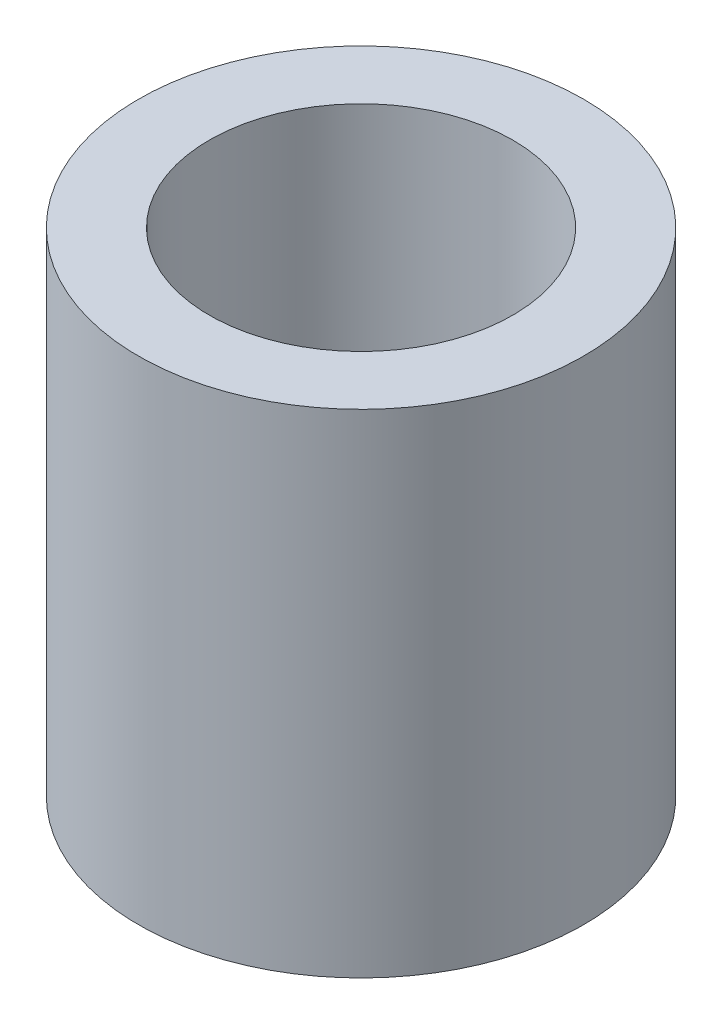
ISO-10303-21;
HEADER;
FILE_DESCRIPTION(('STEP AP214'),'2;1');
FILE_NAME('part.step','',(''),(''),'','','');
FILE_SCHEMA(('AUTOMOTIVE_DESIGN { 1 0 10303 214 1 1 1 1 }'));
ENDSEC;
DATA;
#1=APPLICATION_CONTEXT('core data for automotive mechanical design processes');
#2=APPLICATION_PROTOCOL_DEFINITION('international standard','automotive_design',2000,#1);
#3=PRODUCT_CONTEXT('',#1,'mechanical');
#4=PRODUCT('Part','Part','',(#3));
#5=PRODUCT_RELATED_PRODUCT_CATEGORY('part','',(#4));
#6=PRODUCT_DEFINITION_FORMATION('','',#4);
#7=PRODUCT_DEFINITION_CONTEXT('part definition',#1,'design');
#8=PRODUCT_DEFINITION('design','',#6,#7);
#9=PRODUCT_DEFINITION_SHAPE('','',#8);
#10=(LENGTH_UNIT() NAMED_UNIT(*) SI_UNIT(.MILLI.,.METRE.));
#11=(NAMED_UNIT(*) PLANE_ANGLE_UNIT() SI_UNIT($,.RADIAN.));
#12=(NAMED_UNIT(*) SI_UNIT($,.STERADIAN.) SOLID_ANGLE_UNIT());
#13=UNCERTAINTY_MEASURE_WITH_UNIT(LENGTH_MEASURE(1.E-05),#10,'distance_accuracy_value','');
#14=(GEOMETRIC_REPRESENTATION_CONTEXT(3) GLOBAL_UNCERTAINTY_ASSIGNED_CONTEXT((#13)) GLOBAL_UNIT_ASSIGNED_CONTEXT((#10,
#11,#12)) REPRESENTATION_CONTEXT('',''));
#15=CARTESIAN_POINT('',(0.,0.,0.));
#16=DIRECTION('',(0.,0.,1.));
#17=DIRECTION('',(1.,0.,0.));
#18=AXIS2_PLACEMENT_3D('',#15,#16,#17);
#19=CARTESIAN_POINT('',(-6.6,0.,0.));
#20=DIRECTION('',(0.,1.,0.));
#21=DIRECTION('',(0.,0.,1.));
#22=AXIS2_PLACEMENT_3D('',#19,#20,#21);
#23=PLANE('',#22);
#24=CARTESIAN_POINT('',(0.,0.,0.));
#25=DIRECTION('',(0.,-1.,0.));
#26=DIRECTION('',(0.,0.,-1.));
#27=AXIS2_PLACEMENT_3D('',#24,#25,#26);
#28=CIRCLE('',#27,4.5);
#29=CARTESIAN_POINT('',(0.,0.,-4.5));
#30=VERTEX_POINT('',#29);
#31=EDGE_CURVE('E10',#30,#30,#28,.T.);
#32=ORIENTED_EDGE('',*,*,#31,.F.);
#33=EDGE_LOOP('',(#32));
#34=FACE_BOUND('',#33,.T.);
#35=CARTESIAN_POINT('',(0.,0.,0.));
#36=DIRECTION('',(0.,-1.,0.));
#37=DIRECTION('',(0.,0.,-1.));
#38=AXIS2_PLACEMENT_3D('',#35,#36,#37);
#39=CIRCLE('',#38,6.6);
#40=CARTESIAN_POINT('',(0.,0.,-6.6));
#41=VERTEX_POINT('',#40);
#42=EDGE_CURVE('E45',#41,#41,#39,.T.);
#43=ORIENTED_EDGE('',*,*,#42,.T.);
#44=EDGE_LOOP('',(#43));
#45=FACE_BOUND('',#44,.T.);
#46=ADVANCED_FACE('F31',(#34,#45),#23,.F.);
#47=CARTESIAN_POINT('',(0.,0.,0.));
#48=DIRECTION('',(0.,-1.,0.));
#49=DIRECTION('',(0.,0.,-1.));
#50=AXIS2_PLACEMENT_3D('',#47,#48,#49);
#51=CYLINDRICAL_SURFACE('',#50,4.5);
#52=CARTESIAN_POINT('',(0.,14.605,0.));
#53=DIRECTION('',(0.,-1.,0.));
#54=DIRECTION('',(0.,0.,-1.));
#55=AXIS2_PLACEMENT_3D('',#52,#53,#54);
#56=CIRCLE('',#55,4.5);
#57=CARTESIAN_POINT('',(0.,14.605,-4.5));
#58=VERTEX_POINT('',#57);
#59=EDGE_CURVE('E37',#58,#58,#56,.T.);
#60=ORIENTED_EDGE('',*,*,#59,.F.);
#61=EDGE_LOOP('',(#60));
#62=FACE_BOUND('',#61,.T.);
#63=ORIENTED_EDGE('',*,*,#31,.T.);
#64=EDGE_LOOP('',(#63));
#65=FACE_BOUND('',#64,.T.);
#66=ADVANCED_FACE('F60',(#62,#65),#51,.F.);
#67=CARTESIAN_POINT('',(-4.5,14.605,0.));
#68=DIRECTION('',(0.,-1.,0.));
#69=DIRECTION('',(0.,0.,-1.));
#70=AXIS2_PLACEMENT_3D('',#67,#68,#69);
#71=PLANE('',#70);
#72=CARTESIAN_POINT('',(0.,14.605,0.));
#73=DIRECTION('',(0.,-1.,0.));
#74=DIRECTION('',(0.,0.,-1.));
#75=AXIS2_PLACEMENT_3D('',#72,#73,#74);
#76=CIRCLE('',#75,6.6);
#77=CARTESIAN_POINT('',(0.,14.605,-6.6));
#78=VERTEX_POINT('',#77);
#79=EDGE_CURVE('E41',#78,#78,#76,.T.);
#80=ORIENTED_EDGE('',*,*,#79,.F.);
#81=EDGE_LOOP('',(#80));
#82=FACE_BOUND('',#81,.T.);
#83=ORIENTED_EDGE('',*,*,#59,.T.);
#84=EDGE_LOOP('',(#83));
#85=FACE_BOUND('',#84,.T.);
#86=ADVANCED_FACE('F55',(#82,#85),#71,.F.);
#87=CARTESIAN_POINT('',(0.,0.,0.));
#88=DIRECTION('',(0.,-1.,0.));
#89=DIRECTION('',(0.,0.,-1.));
#90=AXIS2_PLACEMENT_3D('',#87,#88,#89);
#91=CYLINDRICAL_SURFACE('',#90,6.6);
#92=ORIENTED_EDGE('',*,*,#42,.F.);
#93=EDGE_LOOP('',(#92));
#94=FACE_BOUND('',#93,.T.);
#95=ORIENTED_EDGE('',*,*,#79,.T.);
#96=EDGE_LOOP('',(#95));
#97=FACE_BOUND('',#96,.T.);
#98=ADVANCED_FACE('F52',(#94,#97),#91,.T.);
#99=CLOSED_SHELL('',(#46,#66,#86,#98));
#100=MANIFOLD_SOLID_BREP('B2',#99);
#101=ADVANCED_BREP_SHAPE_REPRESENTATION('',(#18,#100),#14);
#102=SHAPE_DEFINITION_REPRESENTATION(#9,#101);
ENDSEC;
END-ISO-10303-21;
